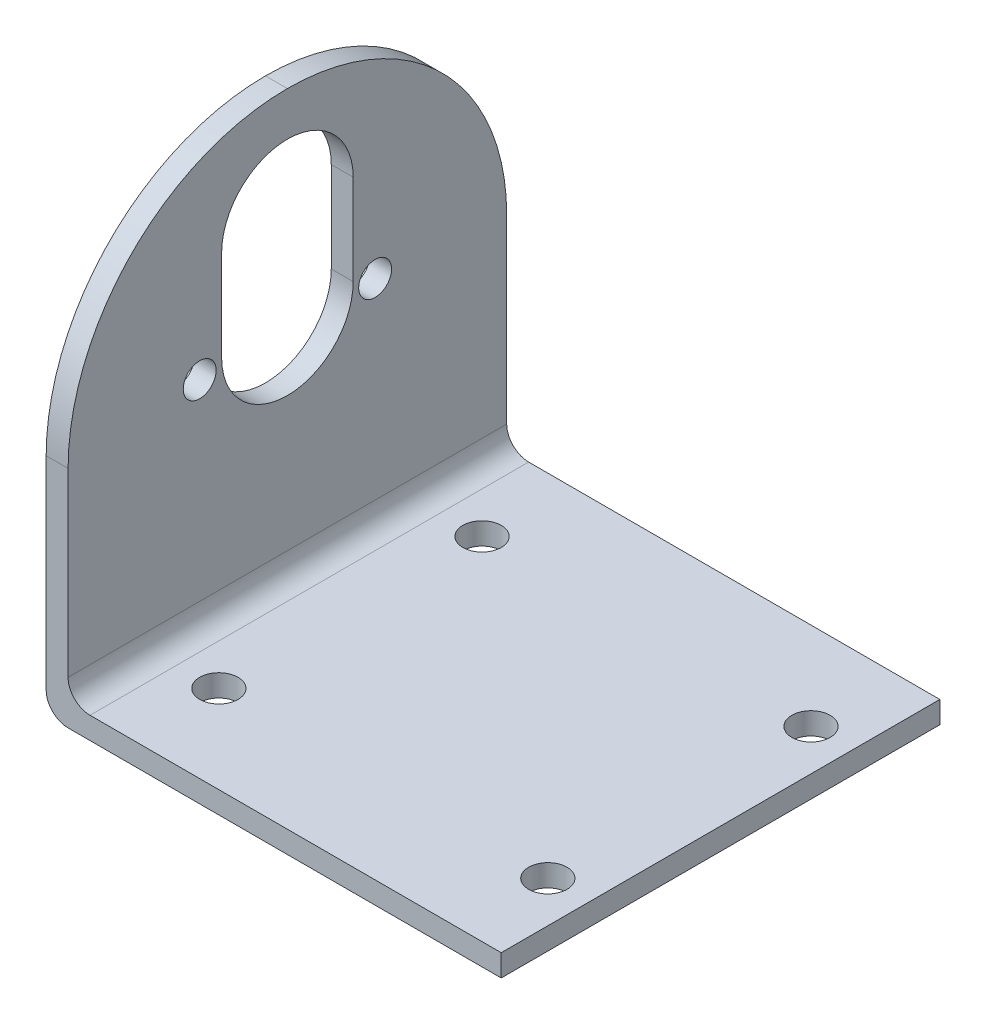
ISO-10303-21;
HEADER;
FILE_DESCRIPTION(('STEP AP214'),'2;1');
FILE_NAME('part.step','',(''),(''),'','','');
FILE_SCHEMA(('AUTOMOTIVE_DESIGN { 1 0 10303 214 1 1 1 1 }'));
ENDSEC;
DATA;
#1=APPLICATION_CONTEXT('core data for automotive mechanical design processes');
#2=APPLICATION_PROTOCOL_DEFINITION('international standard','automotive_design',2000,#1);
#3=PRODUCT_CONTEXT('',#1,'mechanical');
#4=PRODUCT('Part','Part','',(#3));
#5=PRODUCT_RELATED_PRODUCT_CATEGORY('part','',(#4));
#6=PRODUCT_DEFINITION_FORMATION('','',#4);
#7=PRODUCT_DEFINITION_CONTEXT('part definition',#1,'design');
#8=PRODUCT_DEFINITION('design','',#6,#7);
#9=PRODUCT_DEFINITION_SHAPE('','',#8);
#10=(LENGTH_UNIT() NAMED_UNIT(*) SI_UNIT(.MILLI.,.METRE.));
#11=(NAMED_UNIT(*) PLANE_ANGLE_UNIT() SI_UNIT($,.RADIAN.));
#12=(NAMED_UNIT(*) SI_UNIT($,.STERADIAN.) SOLID_ANGLE_UNIT());
#13=UNCERTAINTY_MEASURE_WITH_UNIT(LENGTH_MEASURE(1.E-05),#10,'distance_accuracy_value','');
#14=(GEOMETRIC_REPRESENTATION_CONTEXT(3) GLOBAL_UNCERTAINTY_ASSIGNED_CONTEXT((#13)) GLOBAL_UNIT_ASSIGNED_CONTEXT((#10,
#11,#12)) REPRESENTATION_CONTEXT('',''));
#15=CARTESIAN_POINT('',(0.,0.,0.));
#16=DIRECTION('',(0.,0.,1.));
#17=DIRECTION('',(1.,0.,0.));
#18=AXIS2_PLACEMENT_3D('',#15,#16,#17);
#19=CARTESIAN_POINT('',(-2.,0.,40.));
#20=DIRECTION('',(1.,0.,0.));
#21=DIRECTION('',(0.,1.,0.));
#22=AXIS2_PLACEMENT_3D('',#19,#20,#21);
#23=PLANE('',#22);
#24=CARTESIAN_POINT('',(-2.00000000000002,19.5,28.));
#25=DIRECTION('',(1.,0.,0.));
#26=DIRECTION('',(0.,1.,0.));
#27=AXIS2_PLACEMENT_3D('',#24,#25,#26);
#28=CIRCLE('',#27,1.5);
#29=CARTESIAN_POINT('',(-2.00000000000002,21.,28.));
#30=VERTEX_POINT('',#29);
#31=EDGE_CURVE('E176',#30,#30,#28,.T.);
#32=ORIENTED_EDGE('',*,*,#31,.T.);
#33=EDGE_LOOP('',(#32));
#34=FACE_BOUND('',#33,.T.);
#35=CARTESIAN_POINT('',(-2.00000000000002,19.5,12.));
#36=DIRECTION('',(1.,0.,0.));
#37=DIRECTION('',(0.,-1.,0.));
#38=AXIS2_PLACEMENT_3D('',#35,#36,#37);
#39=CIRCLE('',#38,1.5);
#40=CARTESIAN_POINT('',(-2.00000000000002,18.,12.));
#41=VERTEX_POINT('',#40);
#42=EDGE_CURVE('E169',#41,#41,#39,.T.);
#43=ORIENTED_EDGE('',*,*,#42,.T.);
#44=EDGE_LOOP('',(#43));
#45=FACE_BOUND('',#44,.T.);
#46=DIRECTION('',(0.,-1.,0.));
#47=VECTOR('',#46,1.);
#48=CARTESIAN_POINT('',(-2.00000000000002,28.5,14.));
#49=LINE('',#48,#47);
#50=CARTESIAN_POINT('',(-2.00000000000002,28.5,14.));
#51=VERTEX_POINT('',#50);
#52=CARTESIAN_POINT('',(-2.00000000000001,20.25,14.));
#53=VERTEX_POINT('',#52);
#54=EDGE_CURVE('E153',#51,#53,#49,.T.);
#55=ORIENTED_EDGE('',*,*,#54,.F.);
#56=CARTESIAN_POINT('',(-2.00000000000002,28.5,20.));
#57=DIRECTION('',(1.,0.,0.));
#58=DIRECTION('',(0.,1.,0.));
#59=AXIS2_PLACEMENT_3D('',#56,#57,#58);
#60=CIRCLE('',#59,6.);
#61=CARTESIAN_POINT('',(-2.00000000000002,28.5,26.));
#62=VERTEX_POINT('',#61);
#63=EDGE_CURVE('E145',#51,#62,#60,.T.);
#64=ORIENTED_EDGE('',*,*,#63,.T.);
#65=DIRECTION('',(0.,-1.,0.));
#66=VECTOR('',#65,1.);
#67=CARTESIAN_POINT('',(-2.00000000000002,28.5,26.));
#68=LINE('',#67,#66);
#69=CARTESIAN_POINT('',(-2.,20.25,26.));
#70=VERTEX_POINT('',#69);
#71=EDGE_CURVE('E157',#62,#70,#68,.T.);
#72=ORIENTED_EDGE('',*,*,#71,.T.);
#73=CARTESIAN_POINT('',(-2.00000000000001,20.25,20.));
#74=DIRECTION('',(1.,0.,0.));
#75=DIRECTION('',(0.,1.,0.));
#76=AXIS2_PLACEMENT_3D('',#73,#74,#75);
#77=CIRCLE('',#76,6.);
#78=EDGE_CURVE('E161',#70,#53,#77,.T.);
#79=ORIENTED_EDGE('',*,*,#78,.T.);
#80=EDGE_LOOP('',(#55,#64,#72,#79));
#81=FACE_BOUND('',#80,.T.);
#82=CARTESIAN_POINT('',(-2.,18.5,20.));
#83=DIRECTION('',(1.,0.,0.));
#84=DIRECTION('',(0.,1.,0.));
#85=AXIS2_PLACEMENT_3D('',#82,#83,#84);
#86=CIRCLE('',#85,20.);
#87=CARTESIAN_POINT('',(-2.,18.5,40.));
#88=VERTEX_POINT('',#87);
#89=CARTESIAN_POINT('',(-2.00000000000001,38.5,20.));
#90=VERTEX_POINT('',#89);
#91=EDGE_CURVE('E259',#88,#90,#86,.F.);
#92=ORIENTED_EDGE('',*,*,#91,.T.);
#93=CARTESIAN_POINT('',(-2.,18.5,20.));
#94=DIRECTION('',(1.,0.,0.));
#95=DIRECTION('',(0.,1.,0.));
#96=AXIS2_PLACEMENT_3D('',#93,#94,#95);
#97=CIRCLE('',#96,20.);
#98=CARTESIAN_POINT('',(-2.,18.5,0.));
#99=VERTEX_POINT('',#98);
#100=EDGE_CURVE('E69',#90,#99,#97,.F.);
#101=ORIENTED_EDGE('',*,*,#100,.T.);
#102=DIRECTION('',(0.,-1.,0.));
#103=VECTOR('',#102,1.);
#104=CARTESIAN_POINT('',(-2.,0.,0.));
#105=LINE('',#104,#103);
#106=CARTESIAN_POINT('',(-2.,0.,0.));
#107=VERTEX_POINT('',#106);
#108=EDGE_CURVE('E207',#99,#107,#105,.T.);
#109=ORIENTED_EDGE('',*,*,#108,.T.);
#110=DIRECTION('',(0.,0.,-1.));
#111=VECTOR('',#110,1.);
#112=CARTESIAN_POINT('',(-2.,0.,40.));
#113=LINE('',#112,#111);
#114=CARTESIAN_POINT('',(-2.,0.,40.));
#115=VERTEX_POINT('',#114);
#116=EDGE_CURVE('E253',#115,#107,#113,.T.);
#117=ORIENTED_EDGE('',*,*,#116,.F.);
#118=DIRECTION('',(0.,-1.,0.));
#119=VECTOR('',#118,1.);
#120=CARTESIAN_POINT('',(-2.,0.,40.));
#121=LINE('',#120,#119);
#122=EDGE_CURVE('E210',#88,#115,#121,.T.);
#123=ORIENTED_EDGE('',*,*,#122,.F.);
#124=EDGE_LOOP('',(#92,#101,#109,#117,#123));
#125=FACE_BOUND('',#124,.T.);
#126=ADVANCED_FACE('F47',(#34,#45,#81,#125),#23,.F.);
#127=CARTESIAN_POINT('',(0.,0.,40.));
#128=DIRECTION('',(0.,0.,-1.));
#129=DIRECTION('',(-1.,0.,0.));
#130=AXIS2_PLACEMENT_3D('',#127,#128,#129);
#131=CYLINDRICAL_SURFACE('',#130,2.);
#132=CARTESIAN_POINT('',(0.,0.,0.));
#133=DIRECTION('',(0.,0.,1.));
#134=DIRECTION('',(-1.,0.,0.));
#135=AXIS2_PLACEMENT_3D('',#132,#133,#134);
#136=CIRCLE('',#135,2.);
#137=CARTESIAN_POINT('',(0.,-2.,0.));
#138=VERTEX_POINT('',#137);
#139=EDGE_CURVE('E228',#107,#138,#136,.T.);
#140=ORIENTED_EDGE('',*,*,#139,.T.);
#141=DIRECTION('',(0.,0.,-1.));
#142=VECTOR('',#141,1.);
#143=CARTESIAN_POINT('',(0.,-2.,40.));
#144=LINE('',#143,#142);
#145=CARTESIAN_POINT('',(0.,-2.,40.));
#146=VERTEX_POINT('',#145);
#147=EDGE_CURVE('E250',#146,#138,#144,.T.);
#148=ORIENTED_EDGE('',*,*,#147,.F.);
#149=CARTESIAN_POINT('',(0.,0.,40.));
#150=DIRECTION('',(0.,0.,1.));
#151=DIRECTION('',(-1.,0.,0.));
#152=AXIS2_PLACEMENT_3D('',#149,#150,#151);
#153=CIRCLE('',#152,2.);
#154=EDGE_CURVE('E212',#115,#146,#153,.T.);
#155=ORIENTED_EDGE('',*,*,#154,.F.);
#156=ORIENTED_EDGE('',*,*,#116,.T.);
#157=EDGE_LOOP('',(#140,#148,#155,#156));
#158=FACE_BOUND('',#157,.T.);
#159=ADVANCED_FACE('F286',(#158),#131,.T.);
#160=CARTESIAN_POINT('',(39.5,-2.,40.));
#161=DIRECTION('',(0.,1.,0.));
#162=DIRECTION('',(-1.,0.,0.));
#163=AXIS2_PLACEMENT_3D('',#160,#161,#162);
#164=PLANE('',#163);
#165=CARTESIAN_POINT('',(35.75,-2.,32.));
#166=DIRECTION('',(0.,1.,0.));
#167=DIRECTION('',(0.,0.,-1.));
#168=AXIS2_PLACEMENT_3D('',#165,#166,#167);
#169=CIRCLE('',#168,1.75);
#170=CARTESIAN_POINT('',(35.75,-2.,30.25));
#171=VERTEX_POINT('',#170);
#172=EDGE_CURVE('E196',#171,#171,#169,.T.);
#173=ORIENTED_EDGE('',*,*,#172,.T.);
#174=EDGE_LOOP('',(#173));
#175=FACE_BOUND('',#174,.T.);
#176=CARTESIAN_POINT('',(5.75,-2.,8.00000000000001));
#177=DIRECTION('',(0.,1.,0.));
#178=DIRECTION('',(0.,0.,-1.));
#179=AXIS2_PLACEMENT_3D('',#176,#177,#178);
#180=CIRCLE('',#179,1.75);
#181=CARTESIAN_POINT('',(5.75,-2.,6.25000000000001));
#182=VERTEX_POINT('',#181);
#183=EDGE_CURVE('E189',#182,#182,#180,.T.);
#184=ORIENTED_EDGE('',*,*,#183,.T.);
#185=EDGE_LOOP('',(#184));
#186=FACE_BOUND('',#185,.T.);
#187=CARTESIAN_POINT('',(35.75,-2.,8.));
#188=DIRECTION('',(0.,1.,0.));
#189=DIRECTION('',(0.,0.,1.));
#190=AXIS2_PLACEMENT_3D('',#187,#188,#189);
#191=CIRCLE('',#190,1.75000000000001);
#192=CARTESIAN_POINT('',(35.75,-2.,9.75000000000001));
#193=VERTEX_POINT('',#192);
#194=EDGE_CURVE('E182',#193,#193,#191,.T.);
#195=ORIENTED_EDGE('',*,*,#194,.T.);
#196=EDGE_LOOP('',(#195));
#197=FACE_BOUND('',#196,.T.);
#198=CARTESIAN_POINT('',(5.75,-2.,32.));
#199=DIRECTION('',(0.,1.,0.));
#200=DIRECTION('',(0.,0.,1.));
#201=AXIS2_PLACEMENT_3D('',#198,#199,#200);
#202=CIRCLE('',#201,1.75);
#203=CARTESIAN_POINT('',(5.75,-2.,33.75));
#204=VERTEX_POINT('',#203);
#205=EDGE_CURVE('E204',#204,#204,#202,.T.);
#206=ORIENTED_EDGE('',*,*,#205,.T.);
#207=EDGE_LOOP('',(#206));
#208=FACE_BOUND('',#207,.T.);
#209=DIRECTION('',(1.,0.,0.));
#210=VECTOR('',#209,1.);
#211=CARTESIAN_POINT('',(39.5,-2.,0.));
#212=LINE('',#211,#210);
#213=CARTESIAN_POINT('',(39.5,-2.,0.));
#214=VERTEX_POINT('',#213);
#215=EDGE_CURVE('E230',#138,#214,#212,.T.);
#216=ORIENTED_EDGE('',*,*,#215,.T.);
#217=DIRECTION('',(0.,0.,-1.));
#218=VECTOR('',#217,1.);
#219=CARTESIAN_POINT('',(39.5,-2.,40.));
#220=LINE('',#219,#218);
#221=CARTESIAN_POINT('',(39.5,-2.,40.));
#222=VERTEX_POINT('',#221);
#223=EDGE_CURVE('E247',#222,#214,#220,.T.);
#224=ORIENTED_EDGE('',*,*,#223,.F.);
#225=DIRECTION('',(1.,0.,0.));
#226=VECTOR('',#225,1.);
#227=CARTESIAN_POINT('',(39.5,-2.,40.));
#228=LINE('',#227,#226);
#229=EDGE_CURVE('E215',#146,#222,#228,.T.);
#230=ORIENTED_EDGE('',*,*,#229,.F.);
#231=ORIENTED_EDGE('',*,*,#147,.T.);
#232=EDGE_LOOP('',(#216,#224,#230,#231));
#233=FACE_BOUND('',#232,.T.);
#234=ADVANCED_FACE('F290',(#175,#186,#197,#208,#233),#164,.F.);
#235=CARTESIAN_POINT('',(39.5,0.,40.));
#236=DIRECTION('',(-1.,0.,0.));
#237=DIRECTION('',(0.,0.,1.));
#238=AXIS2_PLACEMENT_3D('',#235,#236,#237);
#239=PLANE('',#238);
#240=DIRECTION('',(0.,1.,0.));
#241=VECTOR('',#240,1.);
#242=CARTESIAN_POINT('',(39.5,0.,0.));
#243=LINE('',#242,#241);
#244=CARTESIAN_POINT('',(39.5,0.,0.));
#245=VERTEX_POINT('',#244);
#246=EDGE_CURVE('E232',#214,#245,#243,.T.);
#247=ORIENTED_EDGE('',*,*,#246,.T.);
#248=DIRECTION('',(0.,0.,-1.));
#249=VECTOR('',#248,1.);
#250=CARTESIAN_POINT('',(39.5,0.,40.));
#251=LINE('',#250,#249);
#252=CARTESIAN_POINT('',(39.5,0.,40.));
#253=VERTEX_POINT('',#252);
#254=EDGE_CURVE('E244',#253,#245,#251,.T.);
#255=ORIENTED_EDGE('',*,*,#254,.F.);
#256=DIRECTION('',(0.,1.,0.));
#257=VECTOR('',#256,1.);
#258=CARTESIAN_POINT('',(39.5,0.,40.));
#259=LINE('',#258,#257);
#260=EDGE_CURVE('E217',#222,#253,#259,.T.);
#261=ORIENTED_EDGE('',*,*,#260,.F.);
#262=ORIENTED_EDGE('',*,*,#223,.T.);
#263=EDGE_LOOP('',(#247,#255,#261,#262));
#264=FACE_BOUND('',#263,.T.);
#265=ADVANCED_FACE('F295',(#264),#239,.F.);
#266=CARTESIAN_POINT('',(2.,0.,40.));
#267=DIRECTION('',(0.,-1.,0.));
#268=DIRECTION('',(0.,0.,-1.));
#269=AXIS2_PLACEMENT_3D('',#266,#267,#268);
#270=PLANE('',#269);
#271=CARTESIAN_POINT('',(35.75,0.,32.));
#272=DIRECTION('',(0.,1.,0.));
#273=DIRECTION('',(0.,0.,-1.));
#274=AXIS2_PLACEMENT_3D('',#271,#272,#273);
#275=CIRCLE('',#274,1.75);
#276=CARTESIAN_POINT('',(35.75,0.,30.25));
#277=VERTEX_POINT('',#276);
#278=EDGE_CURVE('E192',#277,#277,#275,.T.);
#279=ORIENTED_EDGE('',*,*,#278,.F.);
#280=EDGE_LOOP('',(#279));
#281=FACE_BOUND('',#280,.T.);
#282=CARTESIAN_POINT('',(5.75,0.,8.00000000000001));
#283=DIRECTION('',(0.,1.,0.));
#284=DIRECTION('',(0.,0.,-1.));
#285=AXIS2_PLACEMENT_3D('',#282,#283,#284);
#286=CIRCLE('',#285,1.75);
#287=CARTESIAN_POINT('',(5.75,0.,6.25000000000001));
#288=VERTEX_POINT('',#287);
#289=EDGE_CURVE('E199',#288,#288,#286,.T.);
#290=ORIENTED_EDGE('',*,*,#289,.F.);
#291=EDGE_LOOP('',(#290));
#292=FACE_BOUND('',#291,.T.);
#293=CARTESIAN_POINT('',(35.75,0.,8.));
#294=DIRECTION('',(0.,1.,0.));
#295=DIRECTION('',(0.,0.,1.));
#296=AXIS2_PLACEMENT_3D('',#293,#294,#295);
#297=CIRCLE('',#296,1.75000000000001);
#298=CARTESIAN_POINT('',(35.75,0.,9.75000000000001));
#299=VERTEX_POINT('',#298);
#300=EDGE_CURVE('E186',#299,#299,#297,.T.);
#301=ORIENTED_EDGE('',*,*,#300,.F.);
#302=EDGE_LOOP('',(#301));
#303=FACE_BOUND('',#302,.T.);
#304=CARTESIAN_POINT('',(5.75,0.,32.));
#305=DIRECTION('',(0.,1.,0.));
#306=DIRECTION('',(0.,0.,1.));
#307=AXIS2_PLACEMENT_3D('',#304,#305,#306);
#308=CIRCLE('',#307,1.75);
#309=CARTESIAN_POINT('',(5.75,0.,33.75));
#310=VERTEX_POINT('',#309);
#311=EDGE_CURVE('E195',#310,#310,#308,.T.);
#312=ORIENTED_EDGE('',*,*,#311,.F.);
#313=EDGE_LOOP('',(#312));
#314=FACE_BOUND('',#313,.T.);
#315=DIRECTION('',(-1.,0.,0.));
#316=VECTOR('',#315,1.);
#317=CARTESIAN_POINT('',(2.,0.,0.));
#318=LINE('',#317,#316);
#319=CARTESIAN_POINT('',(2.,0.,0.));
#320=VERTEX_POINT('',#319);
#321=EDGE_CURVE('E234',#245,#320,#318,.T.);
#322=ORIENTED_EDGE('',*,*,#321,.T.);
#323=DIRECTION('',(0.,0.,-1.));
#324=VECTOR('',#323,1.);
#325=CARTESIAN_POINT('',(2.,0.,40.));
#326=LINE('',#325,#324);
#327=CARTESIAN_POINT('',(2.,0.,40.));
#328=VERTEX_POINT('',#327);
#329=EDGE_CURVE('E241',#328,#320,#326,.T.);
#330=ORIENTED_EDGE('',*,*,#329,.F.);
#331=DIRECTION('',(-1.,0.,0.));
#332=VECTOR('',#331,1.);
#333=CARTESIAN_POINT('',(2.,0.,40.));
#334=LINE('',#333,#332);
#335=EDGE_CURVE('E219',#253,#328,#334,.T.);
#336=ORIENTED_EDGE('',*,*,#335,.F.);
#337=ORIENTED_EDGE('',*,*,#254,.T.);
#338=EDGE_LOOP('',(#322,#330,#336,#337));
#339=FACE_BOUND('',#338,.T.);
#340=ADVANCED_FACE('F299',(#281,#292,#303,#314,#339),#270,.F.);
#341=CARTESIAN_POINT('',(2.,2.,40.));
#342=DIRECTION('',(0.,0.,-1.));
#343=DIRECTION('',(-1.,0.,0.));
#344=AXIS2_PLACEMENT_3D('',#341,#342,#343);
#345=CYLINDRICAL_SURFACE('',#344,2.);
#346=CARTESIAN_POINT('',(2.,2.,0.));
#347=DIRECTION('',(0.,0.,-1.));
#348=DIRECTION('',(1.,0.,0.));
#349=AXIS2_PLACEMENT_3D('',#346,#347,#348);
#350=CIRCLE('',#349,2.);
#351=CARTESIAN_POINT('',(0.,2.,0.));
#352=VERTEX_POINT('',#351);
#353=EDGE_CURVE('E236',#320,#352,#350,.T.);
#354=ORIENTED_EDGE('',*,*,#353,.T.);
#355=DIRECTION('',(0.,0.,-1.));
#356=VECTOR('',#355,1.);
#357=CARTESIAN_POINT('',(0.,2.,40.));
#358=LINE('',#357,#356);
#359=CARTESIAN_POINT('',(0.,2.,40.));
#360=VERTEX_POINT('',#359);
#361=EDGE_CURVE('E226',#360,#352,#358,.T.);
#362=ORIENTED_EDGE('',*,*,#361,.F.);
#363=CARTESIAN_POINT('',(2.,2.,40.));
#364=DIRECTION('',(0.,0.,-1.));
#365=DIRECTION('',(1.,0.,0.));
#366=AXIS2_PLACEMENT_3D('',#363,#364,#365);
#367=CIRCLE('',#366,2.);
#368=EDGE_CURVE('E221',#328,#360,#367,.T.);
#369=ORIENTED_EDGE('',*,*,#368,.F.);
#370=ORIENTED_EDGE('',*,*,#329,.T.);
#371=EDGE_LOOP('',(#354,#362,#369,#370));
#372=FACE_BOUND('',#371,.T.);
#373=ADVANCED_FACE('F303',(#372),#345,.F.);
#374=CARTESIAN_POINT('',(0.,38.5,40.));
#375=DIRECTION('',(-1.,0.,0.));
#376=DIRECTION('',(0.,-1.,0.));
#377=AXIS2_PLACEMENT_3D('',#374,#375,#376);
#378=PLANE('',#377);
#379=CARTESIAN_POINT('',(0.,19.5,28.));
#380=DIRECTION('',(1.,0.,0.));
#381=DIRECTION('',(0.,1.,0.));
#382=AXIS2_PLACEMENT_3D('',#379,#380,#381);
#383=CIRCLE('',#382,1.5);
#384=CARTESIAN_POINT('',(0.,21.,28.));
#385=VERTEX_POINT('',#384);
#386=EDGE_CURVE('E378',#385,#385,#383,.T.);
#387=ORIENTED_EDGE('',*,*,#386,.F.);
#388=EDGE_LOOP('',(#387));
#389=FACE_BOUND('',#388,.T.);
#390=CARTESIAN_POINT('',(0.,19.5,12.));
#391=DIRECTION('',(1.,0.,0.));
#392=DIRECTION('',(0.,-1.,0.));
#393=AXIS2_PLACEMENT_3D('',#390,#391,#392);
#394=CIRCLE('',#393,1.5);
#395=CARTESIAN_POINT('',(0.,18.,12.));
#396=VERTEX_POINT('',#395);
#397=EDGE_CURVE('E379',#396,#396,#394,.T.);
#398=ORIENTED_EDGE('',*,*,#397,.F.);
#399=EDGE_LOOP('',(#398));
#400=FACE_BOUND('',#399,.T.);
#401=DIRECTION('',(0.,-1.,0.));
#402=VECTOR('',#401,1.);
#403=CARTESIAN_POINT('',(0.,28.5,26.));
#404=LINE('',#403,#402);
#405=CARTESIAN_POINT('',(0.,28.5,26.));
#406=VERTEX_POINT('',#405);
#407=CARTESIAN_POINT('',(0.,20.25,26.));
#408=VERTEX_POINT('',#407);
#409=EDGE_CURVE('E175',#406,#408,#404,.T.);
#410=ORIENTED_EDGE('',*,*,#409,.F.);
#411=CARTESIAN_POINT('',(0.,28.5,20.));
#412=DIRECTION('',(1.,0.,0.));
#413=DIRECTION('',(0.,1.,0.));
#414=AXIS2_PLACEMENT_3D('',#411,#412,#413);
#415=CIRCLE('',#414,6.);
#416=CARTESIAN_POINT('',(0.,28.5,14.));
#417=VERTEX_POINT('',#416);
#418=EDGE_CURVE('E148',#417,#406,#415,.T.);
#419=ORIENTED_EDGE('',*,*,#418,.F.);
#420=DIRECTION('',(0.,-1.,0.));
#421=VECTOR('',#420,1.);
#422=CARTESIAN_POINT('',(0.,28.5,14.));
#423=LINE('',#422,#421);
#424=CARTESIAN_POINT('',(0.,20.25,14.));
#425=VERTEX_POINT('',#424);
#426=EDGE_CURVE('E163',#417,#425,#423,.T.);
#427=ORIENTED_EDGE('',*,*,#426,.T.);
#428=CARTESIAN_POINT('',(0.,20.25,20.));
#429=DIRECTION('',(1.,0.,0.));
#430=DIRECTION('',(0.,1.,0.));
#431=AXIS2_PLACEMENT_3D('',#428,#429,#430);
#432=CIRCLE('',#431,6.);
#433=EDGE_CURVE('E166',#408,#425,#432,.T.);
#434=ORIENTED_EDGE('',*,*,#433,.F.);
#435=EDGE_LOOP('',(#410,#419,#427,#434));
#436=FACE_BOUND('',#435,.T.);
#437=DIRECTION('',(0.,1.,0.));
#438=VECTOR('',#437,1.);
#439=CARTESIAN_POINT('',(0.,38.5,0.));
#440=LINE('',#439,#438);
#441=CARTESIAN_POINT('',(0.,18.5,0.));
#442=VERTEX_POINT('',#441);
#443=EDGE_CURVE('E213',#352,#442,#440,.T.);
#444=ORIENTED_EDGE('',*,*,#443,.T.);
#445=CARTESIAN_POINT('',(0.,18.5,20.));
#446=DIRECTION('',(-1.,0.,0.));
#447=DIRECTION('',(0.,-1.,0.));
#448=AXIS2_PLACEMENT_3D('',#445,#446,#447);
#449=CIRCLE('',#448,20.);
#450=CARTESIAN_POINT('',(0.,38.5,20.));
#451=VERTEX_POINT('',#450);
#452=EDGE_CURVE('E11',#442,#451,#449,.F.);
#453=ORIENTED_EDGE('',*,*,#452,.T.);
#454=CARTESIAN_POINT('',(0.,18.5,20.));
#455=DIRECTION('',(-1.,0.,0.));
#456=DIRECTION('',(0.,-1.,0.));
#457=AXIS2_PLACEMENT_3D('',#454,#455,#456);
#458=CIRCLE('',#457,20.);
#459=CARTESIAN_POINT('',(0.,18.5,40.));
#460=VERTEX_POINT('',#459);
#461=EDGE_CURVE('E264',#451,#460,#458,.F.);
#462=ORIENTED_EDGE('',*,*,#461,.T.);
#463=DIRECTION('',(0.,1.,0.));
#464=VECTOR('',#463,1.);
#465=CARTESIAN_POINT('',(0.,38.5,40.));
#466=LINE('',#465,#464);
#467=EDGE_CURVE('E223',#360,#460,#466,.T.);
#468=ORIENTED_EDGE('',*,*,#467,.F.);
#469=ORIENTED_EDGE('',*,*,#361,.T.);
#470=EDGE_LOOP('',(#444,#453,#462,#468,#469));
#471=FACE_BOUND('',#470,.T.);
#472=ADVANCED_FACE('F269',(#389,#400,#436,#471),#378,.F.);
#473=CARTESIAN_POINT('',(2.,2.,40.));
#474=DIRECTION('',(0.,0.,1.));
#475=DIRECTION('',(1.,0.,0.));
#476=AXIS2_PLACEMENT_3D('',#473,#474,#475);
#477=PLANE('',#476);
#478=ORIENTED_EDGE('',*,*,#467,.T.);
#479=DIRECTION('',(-1.,0.,0.));
#480=VECTOR('',#479,1.);
#481=CARTESIAN_POINT('',(-2.00000000000001,18.5,40.));
#482=LINE('',#481,#480);
#483=EDGE_CURVE('E256',#460,#88,#482,.T.);
#484=ORIENTED_EDGE('',*,*,#483,.T.);
#485=ORIENTED_EDGE('',*,*,#122,.T.);
#486=ORIENTED_EDGE('',*,*,#154,.T.);
#487=ORIENTED_EDGE('',*,*,#229,.T.);
#488=ORIENTED_EDGE('',*,*,#260,.T.);
#489=ORIENTED_EDGE('',*,*,#335,.T.);
#490=ORIENTED_EDGE('',*,*,#368,.T.);
#491=EDGE_LOOP('',(#478,#484,#485,#486,#487,#488,#489,#490));
#492=FACE_BOUND('',#491,.T.);
#493=ADVANCED_FACE('F275',(#492),#477,.T.);
#494=CARTESIAN_POINT('',(2.,2.,0.));
#495=DIRECTION('',(0.,0.,1.));
#496=DIRECTION('',(1.,0.,0.));
#497=AXIS2_PLACEMENT_3D('',#494,#495,#496);
#498=PLANE('',#497);
#499=ORIENTED_EDGE('',*,*,#108,.F.);
#500=DIRECTION('',(-1.,0.,0.));
#501=VECTOR('',#500,1.);
#502=CARTESIAN_POINT('',(2.,18.5,0.));
#503=LINE('',#502,#501);
#504=EDGE_CURVE('E55',#99,#442,#503,.F.);
#505=ORIENTED_EDGE('',*,*,#504,.T.);
#506=ORIENTED_EDGE('',*,*,#443,.F.);
#507=ORIENTED_EDGE('',*,*,#353,.F.);
#508=ORIENTED_EDGE('',*,*,#321,.F.);
#509=ORIENTED_EDGE('',*,*,#246,.F.);
#510=ORIENTED_EDGE('',*,*,#215,.F.);
#511=ORIENTED_EDGE('',*,*,#139,.F.);
#512=EDGE_LOOP('',(#499,#505,#506,#507,#508,#509,#510,#511));
#513=FACE_BOUND('',#512,.T.);
#514=ADVANCED_FACE('F304',(#513),#498,.F.);
#515=CARTESIAN_POINT('',(5.75,-2.,32.));
#516=DIRECTION('',(0.,1.,0.));
#517=DIRECTION('',(0.,0.,1.));
#518=AXIS2_PLACEMENT_3D('',#515,#516,#517);
#519=CYLINDRICAL_SURFACE('',#518,1.75);
#520=ORIENTED_EDGE('',*,*,#205,.F.);
#521=EDGE_LOOP('',(#520));
#522=FACE_BOUND('',#521,.T.);
#523=ORIENTED_EDGE('',*,*,#311,.T.);
#524=EDGE_LOOP('',(#523));
#525=FACE_BOUND('',#524,.T.);
#526=ADVANCED_FACE('F340',(#522,#525),#519,.F.);
#527=CARTESIAN_POINT('',(35.75,-2.,8.));
#528=DIRECTION('',(0.,1.,0.));
#529=DIRECTION('',(0.,0.,1.));
#530=AXIS2_PLACEMENT_3D('',#527,#528,#529);
#531=CYLINDRICAL_SURFACE('',#530,1.75000000000001);
#532=ORIENTED_EDGE('',*,*,#194,.F.);
#533=EDGE_LOOP('',(#532));
#534=FACE_BOUND('',#533,.T.);
#535=ORIENTED_EDGE('',*,*,#300,.T.);
#536=EDGE_LOOP('',(#535));
#537=FACE_BOUND('',#536,.T.);
#538=ADVANCED_FACE('F345',(#534,#537),#531,.F.);
#539=CARTESIAN_POINT('',(5.75,-2.,8.00000000000001));
#540=DIRECTION('',(0.,1.,0.));
#541=DIRECTION('',(0.,0.,1.));
#542=AXIS2_PLACEMENT_3D('',#539,#540,#541);
#543=CYLINDRICAL_SURFACE('',#542,1.75);
#544=ORIENTED_EDGE('',*,*,#183,.F.);
#545=EDGE_LOOP('',(#544));
#546=FACE_BOUND('',#545,.T.);
#547=ORIENTED_EDGE('',*,*,#289,.T.);
#548=EDGE_LOOP('',(#547));
#549=FACE_BOUND('',#548,.T.);
#550=ADVANCED_FACE('F347',(#546,#549),#543,.F.);
#551=CARTESIAN_POINT('',(35.75,-2.,32.));
#552=DIRECTION('',(0.,1.,0.));
#553=DIRECTION('',(0.,0.,1.));
#554=AXIS2_PLACEMENT_3D('',#551,#552,#553);
#555=CYLINDRICAL_SURFACE('',#554,1.75);
#556=ORIENTED_EDGE('',*,*,#172,.F.);
#557=EDGE_LOOP('',(#556));
#558=FACE_BOUND('',#557,.T.);
#559=ORIENTED_EDGE('',*,*,#278,.T.);
#560=EDGE_LOOP('',(#559));
#561=FACE_BOUND('',#560,.T.);
#562=ADVANCED_FACE('F350',(#558,#561),#555,.F.);
#563=CARTESIAN_POINT('',(-2.00000000000002,28.5,20.));
#564=DIRECTION('',(1.,0.,0.));
#565=DIRECTION('',(0.,1.,0.));
#566=AXIS2_PLACEMENT_3D('',#563,#564,#565);
#567=CYLINDRICAL_SURFACE('',#566,6.);
#568=ORIENTED_EDGE('',*,*,#418,.T.);
#569=DIRECTION('',(1.,0.,0.));
#570=VECTOR('',#569,1.);
#571=CARTESIAN_POINT('',(-2.00000000000002,28.5,26.));
#572=LINE('',#571,#570);
#573=EDGE_CURVE('E141',#62,#406,#572,.T.);
#574=ORIENTED_EDGE('',*,*,#573,.F.);
#575=ORIENTED_EDGE('',*,*,#63,.F.);
#576=DIRECTION('',(1.,0.,0.));
#577=VECTOR('',#576,1.);
#578=CARTESIAN_POINT('',(-2.00000000000002,28.5,14.));
#579=LINE('',#578,#577);
#580=EDGE_CURVE('E180',#51,#417,#579,.T.);
#581=ORIENTED_EDGE('',*,*,#580,.T.);
#582=EDGE_LOOP('',(#568,#574,#575,#581));
#583=FACE_BOUND('',#582,.T.);
#584=ADVANCED_FACE('F143',(#583),#567,.F.);
#585=CARTESIAN_POINT('',(-2.00000000000002,28.5,14.));
#586=DIRECTION('',(0.,0.,1.));
#587=DIRECTION('',(0.,-1.,0.));
#588=AXIS2_PLACEMENT_3D('',#585,#586,#587);
#589=PLANE('',#588);
#590=ORIENTED_EDGE('',*,*,#426,.F.);
#591=ORIENTED_EDGE('',*,*,#580,.F.);
#592=ORIENTED_EDGE('',*,*,#54,.T.);
#593=DIRECTION('',(1.,0.,0.));
#594=VECTOR('',#593,1.);
#595=CARTESIAN_POINT('',(-2.00000000000001,20.25,14.));
#596=LINE('',#595,#594);
#597=EDGE_CURVE('E183',#53,#425,#596,.T.);
#598=ORIENTED_EDGE('',*,*,#597,.T.);
#599=EDGE_LOOP('',(#590,#591,#592,#598));
#600=FACE_BOUND('',#599,.T.);
#601=ADVANCED_FACE('F360',(#600),#589,.T.);
#602=CARTESIAN_POINT('',(-2.00000000000001,20.25,20.));
#603=DIRECTION('',(1.,0.,0.));
#604=DIRECTION('',(0.,1.,0.));
#605=AXIS2_PLACEMENT_3D('',#602,#603,#604);
#606=CYLINDRICAL_SURFACE('',#605,6.);
#607=ORIENTED_EDGE('',*,*,#433,.T.);
#608=ORIENTED_EDGE('',*,*,#597,.F.);
#609=ORIENTED_EDGE('',*,*,#78,.F.);
#610=DIRECTION('',(1.,0.,0.));
#611=VECTOR('',#610,1.);
#612=CARTESIAN_POINT('',(-2.00000000000001,20.25,26.));
#613=LINE('',#612,#611);
#614=EDGE_CURVE('E152',#70,#408,#613,.T.);
#615=ORIENTED_EDGE('',*,*,#614,.T.);
#616=EDGE_LOOP('',(#607,#608,#609,#615));
#617=FACE_BOUND('',#616,.T.);
#618=ADVANCED_FACE('F363',(#617),#606,.F.);
#619=CARTESIAN_POINT('',(-2.00000000000002,28.5,26.));
#620=DIRECTION('',(0.,0.,1.));
#621=DIRECTION('',(0.,-1.,0.));
#622=AXIS2_PLACEMENT_3D('',#619,#620,#621);
#623=PLANE('',#622);
#624=ORIENTED_EDGE('',*,*,#409,.T.);
#625=ORIENTED_EDGE('',*,*,#614,.F.);
#626=ORIENTED_EDGE('',*,*,#71,.F.);
#627=ORIENTED_EDGE('',*,*,#573,.T.);
#628=EDGE_LOOP('',(#624,#625,#626,#627));
#629=FACE_BOUND('',#628,.T.);
#630=ADVANCED_FACE('F158',(#629),#623,.F.);
#631=CARTESIAN_POINT('',(2.,18.5,20.));
#632=DIRECTION('',(1.,0.,0.));
#633=DIRECTION('',(0.,0.,-1.));
#634=AXIS2_PLACEMENT_3D('',#631,#632,#633);
#635=CYLINDRICAL_SURFACE('',#634,20.);
#636=ORIENTED_EDGE('',*,*,#461,.F.);
#637=DIRECTION('',(-1.,0.,0.));
#638=VECTOR('',#637,1.);
#639=CARTESIAN_POINT('',(0.,38.5,20.));
#640=LINE('',#639,#638);
#641=EDGE_CURVE('E261',#90,#451,#640,.F.);
#642=ORIENTED_EDGE('',*,*,#641,.F.);
#643=ORIENTED_EDGE('',*,*,#91,.F.);
#644=ORIENTED_EDGE('',*,*,#483,.F.);
#645=EDGE_LOOP('',(#636,#642,#643,#644));
#646=FACE_BOUND('',#645,.T.);
#647=ADVANCED_FACE('F279',(#646),#635,.T.);
#648=CARTESIAN_POINT('',(-2.00000000000001,18.5,20.));
#649=DIRECTION('',(-1.,0.,0.));
#650=DIRECTION('',(0.,0.,1.));
#651=AXIS2_PLACEMENT_3D('',#648,#649,#650);
#652=CYLINDRICAL_SURFACE('',#651,20.);
#653=ORIENTED_EDGE('',*,*,#452,.F.);
#654=ORIENTED_EDGE('',*,*,#504,.F.);
#655=ORIENTED_EDGE('',*,*,#100,.F.);
#656=ORIENTED_EDGE('',*,*,#641,.T.);
#657=EDGE_LOOP('',(#653,#654,#655,#656));
#658=FACE_BOUND('',#657,.T.);
#659=ADVANCED_FACE('F49',(#658),#652,.T.);
#660=CARTESIAN_POINT('',(-2.00000000000002,19.5,12.));
#661=DIRECTION('',(1.,0.,0.));
#662=DIRECTION('',(0.,1.,0.));
#663=AXIS2_PLACEMENT_3D('',#660,#661,#662);
#664=CYLINDRICAL_SURFACE('',#663,1.5);
#665=ORIENTED_EDGE('',*,*,#42,.F.);
#666=EDGE_LOOP('',(#665));
#667=FACE_BOUND('',#666,.T.);
#668=ORIENTED_EDGE('',*,*,#397,.T.);
#669=EDGE_LOOP('',(#668));
#670=FACE_BOUND('',#669,.T.);
#671=ADVANCED_FACE('F307',(#667,#670),#664,.F.);
#672=CARTESIAN_POINT('',(-2.00000000000002,19.5,28.));
#673=DIRECTION('',(1.,0.,0.));
#674=DIRECTION('',(0.,1.,0.));
#675=AXIS2_PLACEMENT_3D('',#672,#673,#674);
#676=CYLINDRICAL_SURFACE('',#675,1.5);
#677=ORIENTED_EDGE('',*,*,#31,.F.);
#678=EDGE_LOOP('',(#677));
#679=FACE_BOUND('',#678,.T.);
#680=ORIENTED_EDGE('',*,*,#386,.T.);
#681=EDGE_LOOP('',(#680));
#682=FACE_BOUND('',#681,.T.);
#683=ADVANCED_FACE('F313',(#679,#682),#676,.F.);
#684=CLOSED_SHELL('',(#126,#159,#234,#265,#340,#373,#472,#493,#514,#526,#538,#550,#562,#584,
#601,#618,#630,#647,#659,#671,#683));
#685=MANIFOLD_SOLID_BREP('B2',#684);
#686=ADVANCED_BREP_SHAPE_REPRESENTATION('',(#18,#685),#14);
#687=SHAPE_DEFINITION_REPRESENTATION(#9,#686);
ENDSEC;
END-ISO-10303-21;
